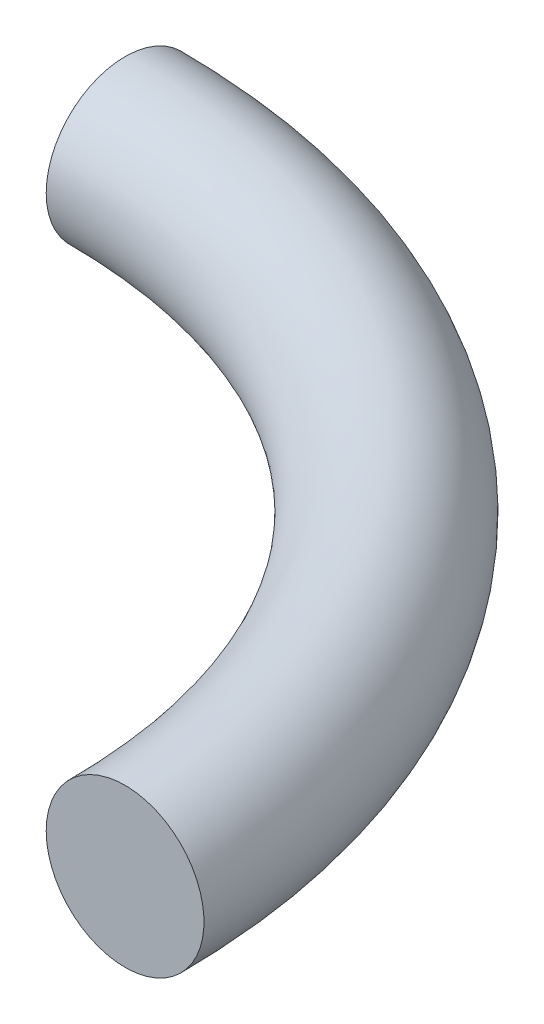
ISO-10303-21;
HEADER;
FILE_DESCRIPTION(('STEP AP214'),'2;1');
FILE_NAME('part.step','',(''),(''),'','','');
FILE_SCHEMA(('AUTOMOTIVE_DESIGN { 1 0 10303 214 1 1 1 1 }'));
ENDSEC;
DATA;
#1=APPLICATION_CONTEXT('core data for automotive mechanical design processes');
#2=APPLICATION_PROTOCOL_DEFINITION('international standard','automotive_design',2000,#1);
#3=PRODUCT_CONTEXT('',#1,'mechanical');
#4=PRODUCT('Part','Part','',(#3));
#5=PRODUCT_RELATED_PRODUCT_CATEGORY('part','',(#4));
#6=PRODUCT_DEFINITION_FORMATION('','',#4);
#7=PRODUCT_DEFINITION_CONTEXT('part definition',#1,'design');
#8=PRODUCT_DEFINITION('design','',#6,#7);
#9=PRODUCT_DEFINITION_SHAPE('','',#8);
#10=(LENGTH_UNIT() NAMED_UNIT(*) SI_UNIT(.MILLI.,.METRE.));
#11=(NAMED_UNIT(*) PLANE_ANGLE_UNIT() SI_UNIT($,.RADIAN.));
#12=(NAMED_UNIT(*) SI_UNIT($,.STERADIAN.) SOLID_ANGLE_UNIT());
#13=UNCERTAINTY_MEASURE_WITH_UNIT(LENGTH_MEASURE(1.E-05),#10,'distance_accuracy_value','');
#14=(GEOMETRIC_REPRESENTATION_CONTEXT(3) GLOBAL_UNCERTAINTY_ASSIGNED_CONTEXT((#13)) GLOBAL_UNIT_ASSIGNED_CONTEXT((#10,
#11,#12)) REPRESENTATION_CONTEXT('',''));
#15=CARTESIAN_POINT('',(0.,0.,0.));
#16=DIRECTION('',(0.,0.,1.));
#17=DIRECTION('',(1.,0.,0.));
#18=AXIS2_PLACEMENT_3D('',#15,#16,#17);
#19=CARTESIAN_POINT('',(50.8,0.,0.));
#20=DIRECTION('',(0.,0.,-1.));
#21=DIRECTION('',(-1.,0.,0.));
#22=AXIS2_PLACEMENT_3D('',#19,#20,#21);
#23=PLANE('',#22);
#24=CARTESIAN_POINT('',(50.8,0.,0.));
#25=DIRECTION('',(0.,0.,-1.));
#26=DIRECTION('',(-1.,0.,0.));
#27=AXIS2_PLACEMENT_3D('',#24,#25,#26);
#28=CIRCLE('',#27,6.35);
#29=CARTESIAN_POINT('',(44.45,0.,0.));
#30=VERTEX_POINT('',#29);
#31=EDGE_CURVE('E46',#30,#30,#28,.T.);
#32=ORIENTED_EDGE('',*,*,#31,.F.);
#33=EDGE_LOOP('',(#32));
#34=FACE_BOUND('',#33,.T.);
#35=ADVANCED_FACE('F39',(#34),#23,.F.);
#36=CARTESIAN_POINT('',(0.,0.,-50.8));
#37=DIRECTION('',(-1.,0.,0.));
#38=DIRECTION('',(0.,0.,1.));
#39=AXIS2_PLACEMENT_3D('',#36,#37,#38);
#40=PLANE('',#39);
#41=CARTESIAN_POINT('',(0.,0.,-50.8));
#42=DIRECTION('',(-1.,0.,0.));
#43=DIRECTION('',(0.,0.,1.));
#44=AXIS2_PLACEMENT_3D('',#41,#42,#43);
#45=CIRCLE('',#44,6.35);
#46=CARTESIAN_POINT('',(0.,0.,-44.45));
#47=VERTEX_POINT('',#46);
#48=EDGE_CURVE('E12',#47,#47,#45,.T.);
#49=ORIENTED_EDGE('',*,*,#48,.T.);
#50=EDGE_LOOP('',(#49));
#51=FACE_BOUND('',#50,.T.);
#52=ADVANCED_FACE('F53',(#51),#40,.T.);
#53=CARTESIAN_POINT('',(0.,0.,0.));
#54=DIRECTION('',(0.,1.,0.));
#55=DIRECTION('',(0.,0.,1.));
#56=AXIS2_PLACEMENT_3D('',#53,#54,#55);
#57=TOROIDAL_SURFACE('',#56,50.8,6.35);
#58=ORIENTED_EDGE('',*,*,#48,.F.);
#59=EDGE_LOOP('',(#58));
#60=FACE_BOUND('',#59,.T.);
#61=ORIENTED_EDGE('',*,*,#31,.T.);
#62=EDGE_LOOP('',(#61));
#63=FACE_BOUND('',#62,.T.);
#64=ADVANCED_FACE('F55',(#60,#63),#57,.T.);
#65=CLOSED_SHELL('',(#35,#52,#64));
#66=MANIFOLD_SOLID_BREP('B2',#65);
#67=ADVANCED_BREP_SHAPE_REPRESENTATION('',(#18,#66),#14);
#68=SHAPE_DEFINITION_REPRESENTATION(#9,#67);
ENDSEC;
END-ISO-10303-21;
